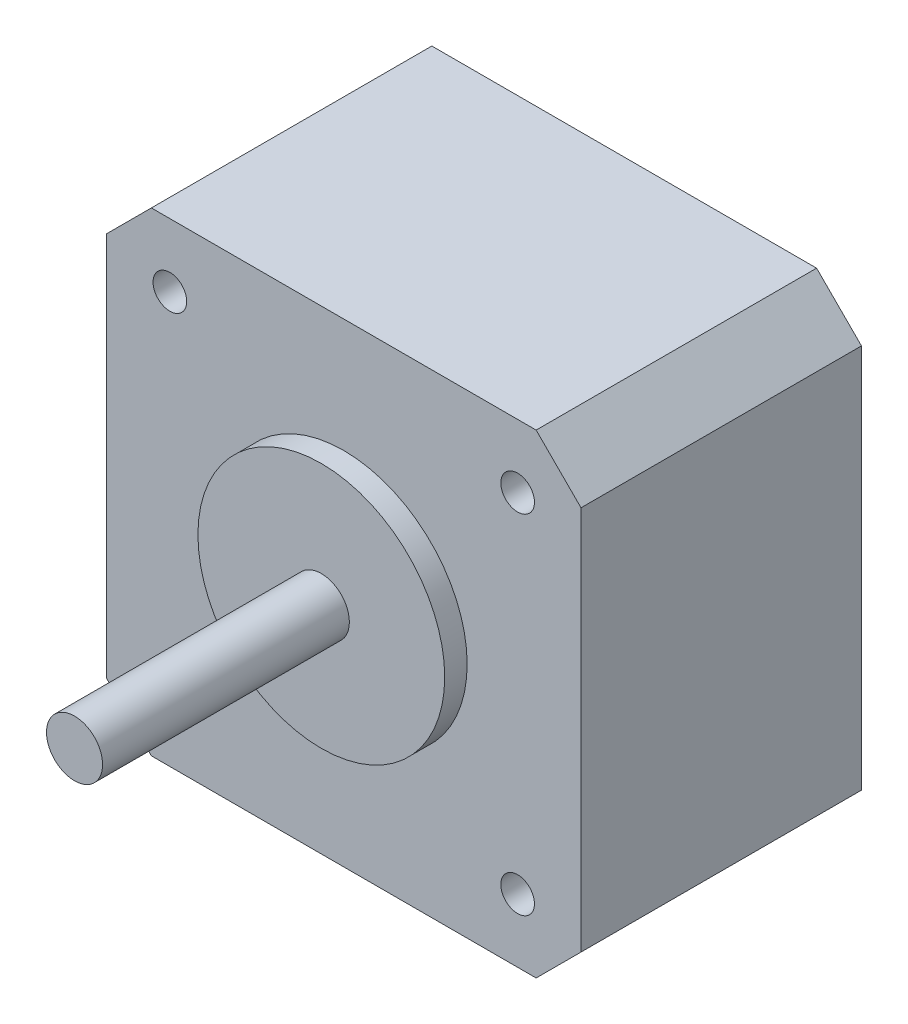
ISO-10303-21;
HEADER;
FILE_DESCRIPTION(('STEP AP214'),'2;1');
FILE_NAME('part.step','',(''),(''),'','','');
FILE_SCHEMA(('AUTOMOTIVE_DESIGN { 1 0 10303 214 1 1 1 1 }'));
ENDSEC;
DATA;
#1=APPLICATION_CONTEXT('core data for automotive mechanical design processes');
#2=APPLICATION_PROTOCOL_DEFINITION('international standard','automotive_design',2000,#1);
#3=PRODUCT_CONTEXT('',#1,'mechanical');
#4=PRODUCT('Part','Part','',(#3));
#5=PRODUCT_RELATED_PRODUCT_CATEGORY('part','',(#4));
#6=PRODUCT_DEFINITION_FORMATION('','',#4);
#7=PRODUCT_DEFINITION_CONTEXT('part definition',#1,'design');
#8=PRODUCT_DEFINITION('design','',#6,#7);
#9=PRODUCT_DEFINITION_SHAPE('','',#8);
#10=(LENGTH_UNIT() NAMED_UNIT(*) SI_UNIT(.MILLI.,.METRE.));
#11=(NAMED_UNIT(*) PLANE_ANGLE_UNIT() SI_UNIT($,.RADIAN.));
#12=(NAMED_UNIT(*) SI_UNIT($,.STERADIAN.) SOLID_ANGLE_UNIT());
#13=UNCERTAINTY_MEASURE_WITH_UNIT(LENGTH_MEASURE(1.E-05),#10,'distance_accuracy_value','');
#14=(GEOMETRIC_REPRESENTATION_CONTEXT(3) GLOBAL_UNCERTAINTY_ASSIGNED_CONTEXT((#13)) GLOBAL_UNIT_ASSIGNED_CONTEXT((#10,
#11,#12)) REPRESENTATION_CONTEXT('',''));
#15=CARTESIAN_POINT('',(0.,0.,0.));
#16=DIRECTION('',(0.,0.,1.));
#17=DIRECTION('',(1.,0.,0.));
#18=AXIS2_PLACEMENT_3D('',#15,#16,#17);
#19=CARTESIAN_POINT('',(21.15,21.15,-25.));
#20=DIRECTION('',(1.,0.,0.));
#21=DIRECTION('',(0.,0.,-1.));
#22=AXIS2_PLACEMENT_3D('',#19,#20,#21);
#23=PLANE('',#22);
#24=DIRECTION('',(0.,1.,0.));
#25=VECTOR('',#24,1.);
#26=CARTESIAN_POINT('',(21.15,21.15,0.));
#27=LINE('',#26,#25);
#28=CARTESIAN_POINT('',(21.15,-17.15,0.));
#29=VERTEX_POINT('',#28);
#30=CARTESIAN_POINT('',(21.15,17.15,0.));
#31=VERTEX_POINT('',#30);
#32=EDGE_CURVE('E158',#29,#31,#27,.T.);
#33=ORIENTED_EDGE('',*,*,#32,.F.);
#34=DIRECTION('',(0.,0.,-1.));
#35=VECTOR('',#34,1.);
#36=CARTESIAN_POINT('',(21.15,-17.15,-25.));
#37=LINE('',#36,#35);
#38=CARTESIAN_POINT('',(21.15,-17.15,-25.));
#39=VERTEX_POINT('',#38);
#40=EDGE_CURVE('E147',#29,#39,#37,.T.);
#41=ORIENTED_EDGE('',*,*,#40,.T.);
#42=DIRECTION('',(0.,1.,0.));
#43=VECTOR('',#42,1.);
#44=CARTESIAN_POINT('',(21.15,21.15,-25.));
#45=LINE('',#44,#43);
#46=CARTESIAN_POINT('',(21.15,17.15,-25.));
#47=VERTEX_POINT('',#46);
#48=EDGE_CURVE('E151',#39,#47,#45,.T.);
#49=ORIENTED_EDGE('',*,*,#48,.T.);
#50=DIRECTION('',(0.,0.,1.));
#51=VECTOR('',#50,1.);
#52=CARTESIAN_POINT('',(21.15,17.15,-25.));
#53=LINE('',#52,#51);
#54=EDGE_CURVE('E144',#47,#31,#53,.T.);
#55=ORIENTED_EDGE('',*,*,#54,.T.);
#56=EDGE_LOOP('',(#33,#41,#49,#55));
#57=FACE_BOUND('',#56,.T.);
#58=ADVANCED_FACE('F34',(#57),#23,.T.);
#59=CARTESIAN_POINT('',(-21.15,-21.15,-25.));
#60=DIRECTION('',(0.,-1.,0.));
#61=DIRECTION('',(0.,0.,-1.));
#62=AXIS2_PLACEMENT_3D('',#59,#60,#61);
#63=PLANE('',#62);
#64=DIRECTION('',(1.,0.,0.));
#65=VECTOR('',#64,1.);
#66=CARTESIAN_POINT('',(-21.15,-21.15,0.));
#67=LINE('',#66,#65);
#68=CARTESIAN_POINT('',(-17.15,-21.15,0.));
#69=VERTEX_POINT('',#68);
#70=CARTESIAN_POINT('',(17.15,-21.15,0.));
#71=VERTEX_POINT('',#70);
#72=EDGE_CURVE('E117',#69,#71,#67,.T.);
#73=ORIENTED_EDGE('',*,*,#72,.F.);
#74=DIRECTION('',(0.,0.,-1.));
#75=VECTOR('',#74,1.);
#76=CARTESIAN_POINT('',(-17.15,-21.15,-25.));
#77=LINE('',#76,#75);
#78=CARTESIAN_POINT('',(-17.15,-21.15,-25.));
#79=VERTEX_POINT('',#78);
#80=EDGE_CURVE('E135',#69,#79,#77,.T.);
#81=ORIENTED_EDGE('',*,*,#80,.T.);
#82=DIRECTION('',(1.,0.,0.));
#83=VECTOR('',#82,1.);
#84=CARTESIAN_POINT('',(-21.15,-21.15,-25.));
#85=LINE('',#84,#83);
#86=CARTESIAN_POINT('',(17.15,-21.15,-25.));
#87=VERTEX_POINT('',#86);
#88=EDGE_CURVE('E119',#79,#87,#85,.T.);
#89=ORIENTED_EDGE('',*,*,#88,.T.);
#90=DIRECTION('',(0.,0.,1.));
#91=VECTOR('',#90,1.);
#92=CARTESIAN_POINT('',(17.15,-21.15,-25.));
#93=LINE('',#92,#91);
#94=EDGE_CURVE('E132',#87,#71,#93,.T.);
#95=ORIENTED_EDGE('',*,*,#94,.T.);
#96=EDGE_LOOP('',(#73,#81,#89,#95));
#97=FACE_BOUND('',#96,.T.);
#98=ADVANCED_FACE('F241',(#97),#63,.T.);
#99=CARTESIAN_POINT('',(-21.15,21.15,-25.));
#100=DIRECTION('',(-1.,0.,0.));
#101=DIRECTION('',(0.,-1.,0.));
#102=AXIS2_PLACEMENT_3D('',#99,#100,#101);
#103=PLANE('',#102);
#104=DIRECTION('',(0.,-1.,0.));
#105=VECTOR('',#104,1.);
#106=CARTESIAN_POINT('',(-21.15,21.15,-25.));
#107=LINE('',#106,#105);
#108=CARTESIAN_POINT('',(-21.15,17.15,-25.));
#109=VERTEX_POINT('',#108);
#110=CARTESIAN_POINT('',(-21.15,-17.15,-25.));
#111=VERTEX_POINT('',#110);
#112=EDGE_CURVE('E123',#109,#111,#107,.T.);
#113=ORIENTED_EDGE('',*,*,#112,.T.);
#114=DIRECTION('',(0.,0.,1.));
#115=VECTOR('',#114,1.);
#116=CARTESIAN_POINT('',(-21.15,-17.15,-25.));
#117=LINE('',#116,#115);
#118=CARTESIAN_POINT('',(-21.15,-17.15,0.));
#119=VERTEX_POINT('',#118);
#120=EDGE_CURVE('E109',#111,#119,#117,.T.);
#121=ORIENTED_EDGE('',*,*,#120,.T.);
#122=DIRECTION('',(0.,-1.,0.));
#123=VECTOR('',#122,1.);
#124=CARTESIAN_POINT('',(-21.15,21.15,0.));
#125=LINE('',#124,#123);
#126=CARTESIAN_POINT('',(-21.15,17.15,0.));
#127=VERTEX_POINT('',#126);
#128=EDGE_CURVE('E102',#127,#119,#125,.T.);
#129=ORIENTED_EDGE('',*,*,#128,.F.);
#130=DIRECTION('',(0.,0.,-1.));
#131=VECTOR('',#130,1.);
#132=CARTESIAN_POINT('',(-21.15,17.15,-25.));
#133=LINE('',#132,#131);
#134=EDGE_CURVE('E115',#127,#109,#133,.T.);
#135=ORIENTED_EDGE('',*,*,#134,.T.);
#136=EDGE_LOOP('',(#113,#121,#129,#135));
#137=FACE_BOUND('',#136,.T.);
#138=ADVANCED_FACE('F114',(#137),#103,.T.);
#139=CARTESIAN_POINT('',(-21.15,21.15,-25.));
#140=DIRECTION('',(0.,1.,0.));
#141=DIRECTION('',(0.,0.,1.));
#142=AXIS2_PLACEMENT_3D('',#139,#140,#141);
#143=PLANE('',#142);
#144=DIRECTION('',(-1.,0.,0.));
#145=VECTOR('',#144,1.);
#146=CARTESIAN_POINT('',(-21.15,21.15,0.));
#147=LINE('',#146,#145);
#148=CARTESIAN_POINT('',(17.15,21.15,0.));
#149=VERTEX_POINT('',#148);
#150=CARTESIAN_POINT('',(-17.15,21.15,0.));
#151=VERTEX_POINT('',#150);
#152=EDGE_CURVE('E103',#149,#151,#147,.T.);
#153=ORIENTED_EDGE('',*,*,#152,.F.);
#154=DIRECTION('',(0.,0.,-1.));
#155=VECTOR('',#154,1.);
#156=CARTESIAN_POINT('',(17.15,21.15,-25.));
#157=LINE('',#156,#155);
#158=CARTESIAN_POINT('',(17.15,21.15,-25.));
#159=VERTEX_POINT('',#158);
#160=EDGE_CURVE('E12',#149,#159,#157,.T.);
#161=ORIENTED_EDGE('',*,*,#160,.T.);
#162=DIRECTION('',(-1.,0.,0.));
#163=VECTOR('',#162,1.);
#164=CARTESIAN_POINT('',(-21.15,21.15,-25.));
#165=LINE('',#164,#163);
#166=CARTESIAN_POINT('',(-17.15,21.15,-25.));
#167=VERTEX_POINT('',#166);
#168=EDGE_CURVE('E149',#159,#167,#165,.T.);
#169=ORIENTED_EDGE('',*,*,#168,.T.);
#170=DIRECTION('',(0.,0.,1.));
#171=VECTOR('',#170,1.);
#172=CARTESIAN_POINT('',(-17.15,21.15,-25.));
#173=LINE('',#172,#171);
#174=EDGE_CURVE('E42',#167,#151,#173,.T.);
#175=ORIENTED_EDGE('',*,*,#174,.T.);
#176=EDGE_LOOP('',(#153,#161,#169,#175));
#177=FACE_BOUND('',#176,.T.);
#178=ADVANCED_FACE('F148',(#177),#143,.T.);
#179=CARTESIAN_POINT('',(0.,0.,-25.));
#180=DIRECTION('',(0.,0.,1.));
#181=DIRECTION('',(1.,0.,0.));
#182=AXIS2_PLACEMENT_3D('',#179,#180,#181);
#183=PLANE('',#182);
#184=ORIENTED_EDGE('',*,*,#88,.F.);
#185=DIRECTION('',(0.707106781186549,-0.707106781186546,0.));
#186=VECTOR('',#185,1.);
#187=CARTESIAN_POINT('',(-21.15,-17.15,-25.));
#188=LINE('',#187,#186);
#189=EDGE_CURVE('E142',#79,#111,#188,.F.);
#190=ORIENTED_EDGE('',*,*,#189,.T.);
#191=ORIENTED_EDGE('',*,*,#112,.F.);
#192=DIRECTION('',(-0.707106781186546,-0.707106781186549,0.));
#193=VECTOR('',#192,1.);
#194=CARTESIAN_POINT('',(-17.15,21.15,-25.));
#195=LINE('',#194,#193);
#196=EDGE_CURVE('E49',#109,#167,#195,.F.);
#197=ORIENTED_EDGE('',*,*,#196,.T.);
#198=ORIENTED_EDGE('',*,*,#168,.F.);
#199=DIRECTION('',(-0.707106781186549,0.707106781186546,0.));
#200=VECTOR('',#199,1.);
#201=CARTESIAN_POINT('',(21.15,17.15,-25.));
#202=LINE('',#201,#200);
#203=EDGE_CURVE('E138',#159,#47,#202,.F.);
#204=ORIENTED_EDGE('',*,*,#203,.T.);
#205=ORIENTED_EDGE('',*,*,#48,.F.);
#206=DIRECTION('',(0.707106781186545,0.70710678118655,0.));
#207=VECTOR('',#206,1.);
#208=CARTESIAN_POINT('',(17.15,-21.15,-25.));
#209=LINE('',#208,#207);
#210=EDGE_CURVE('E140',#39,#87,#209,.F.);
#211=ORIENTED_EDGE('',*,*,#210,.T.);
#212=EDGE_LOOP('',(#184,#190,#191,#197,#198,#204,#205,#211));
#213=FACE_BOUND('',#212,.T.);
#214=ADVANCED_FACE('F220',(#213),#183,.F.);
#215=CARTESIAN_POINT('',(0.,0.,0.));
#216=DIRECTION('',(0.,0.,1.));
#217=DIRECTION('',(1.,0.,0.));
#218=AXIS2_PLACEMENT_3D('',#215,#216,#217);
#219=PLANE('',#218);
#220=CARTESIAN_POINT('',(0.,0.,0.));
#221=DIRECTION('',(0.,0.,1.));
#222=DIRECTION('',(1.,0.,0.));
#223=AXIS2_PLACEMENT_3D('',#220,#221,#222);
#224=CIRCLE('',#223,11.);
#225=CARTESIAN_POINT('',(11.,0.,0.));
#226=VERTEX_POINT('',#225);
#227=EDGE_CURVE('E189',#226,#226,#224,.T.);
#228=ORIENTED_EDGE('',*,*,#227,.F.);
#229=EDGE_LOOP('',(#228));
#230=FACE_BOUND('',#229,.T.);
#231=CARTESIAN_POINT('',(15.5,15.5,0.));
#232=DIRECTION('',(0.,0.,1.));
#233=DIRECTION('',(1.,0.,0.));
#234=AXIS2_PLACEMENT_3D('',#231,#232,#233);
#235=CIRCLE('',#234,1.5);
#236=CARTESIAN_POINT('',(17.,15.5,0.));
#237=VERTEX_POINT('',#236);
#238=EDGE_CURVE('E184',#237,#237,#235,.T.);
#239=ORIENTED_EDGE('',*,*,#238,.F.);
#240=EDGE_LOOP('',(#239));
#241=FACE_BOUND('',#240,.T.);
#242=CARTESIAN_POINT('',(15.5,-15.5,0.));
#243=DIRECTION('',(0.,0.,1.));
#244=DIRECTION('',(1.,0.,0.));
#245=AXIS2_PLACEMENT_3D('',#242,#243,#244);
#246=CIRCLE('',#245,1.5);
#247=CARTESIAN_POINT('',(17.,-15.5,0.));
#248=VERTEX_POINT('',#247);
#249=EDGE_CURVE('E178',#248,#248,#246,.T.);
#250=ORIENTED_EDGE('',*,*,#249,.F.);
#251=EDGE_LOOP('',(#250));
#252=FACE_BOUND('',#251,.T.);
#253=CARTESIAN_POINT('',(-15.5,-15.5,0.));
#254=DIRECTION('',(0.,0.,1.));
#255=DIRECTION('',(1.,0.,0.));
#256=AXIS2_PLACEMENT_3D('',#253,#254,#255);
#257=CIRCLE('',#256,1.5);
#258=CARTESIAN_POINT('',(-14.,-15.5,0.));
#259=VERTEX_POINT('',#258);
#260=EDGE_CURVE('E171',#259,#259,#257,.T.);
#261=ORIENTED_EDGE('',*,*,#260,.F.);
#262=EDGE_LOOP('',(#261));
#263=FACE_BOUND('',#262,.T.);
#264=CARTESIAN_POINT('',(-15.5,15.5,0.));
#265=DIRECTION('',(0.,0.,1.));
#266=DIRECTION('',(1.,0.,0.));
#267=AXIS2_PLACEMENT_3D('',#264,#265,#266);
#268=CIRCLE('',#267,1.5);
#269=CARTESIAN_POINT('',(-14.,15.5,0.));
#270=VERTEX_POINT('',#269);
#271=EDGE_CURVE('E164',#270,#270,#268,.T.);
#272=ORIENTED_EDGE('',*,*,#271,.F.);
#273=EDGE_LOOP('',(#272));
#274=FACE_BOUND('',#273,.T.);
#275=ORIENTED_EDGE('',*,*,#128,.T.);
#276=DIRECTION('',(-0.707106781186549,0.707106781186546,0.));
#277=VECTOR('',#276,1.);
#278=CARTESIAN_POINT('',(-19.15,-19.15,0.));
#279=LINE('',#278,#277);
#280=EDGE_CURVE('E130',#119,#69,#279,.F.);
#281=ORIENTED_EDGE('',*,*,#280,.T.);
#282=ORIENTED_EDGE('',*,*,#72,.T.);
#283=DIRECTION('',(-0.707106781186545,-0.70710678118655,0.));
#284=VECTOR('',#283,1.);
#285=CARTESIAN_POINT('',(19.15,-19.1499999999999,0.));
#286=LINE('',#285,#284);
#287=EDGE_CURVE('E128',#71,#29,#286,.F.);
#288=ORIENTED_EDGE('',*,*,#287,.T.);
#289=ORIENTED_EDGE('',*,*,#32,.T.);
#290=DIRECTION('',(0.707106781186549,-0.707106781186546,0.));
#291=VECTOR('',#290,1.);
#292=CARTESIAN_POINT('',(19.1499999999999,19.15,0.));
#293=LINE('',#292,#291);
#294=EDGE_CURVE('E108',#31,#149,#293,.F.);
#295=ORIENTED_EDGE('',*,*,#294,.T.);
#296=ORIENTED_EDGE('',*,*,#152,.T.);
#297=DIRECTION('',(0.707106781186546,0.707106781186549,0.));
#298=VECTOR('',#297,1.);
#299=CARTESIAN_POINT('',(-19.15,19.1499999999999,0.));
#300=LINE('',#299,#298);
#301=EDGE_CURVE('E99',#151,#127,#300,.F.);
#302=ORIENTED_EDGE('',*,*,#301,.T.);
#303=EDGE_LOOP('',(#275,#281,#282,#288,#289,#295,#296,#302));
#304=FACE_BOUND('',#303,.T.);
#305=ADVANCED_FACE('F101',(#230,#241,#252,#263,#274,#304),#219,.T.);
#306=CARTESIAN_POINT('',(-15.5,15.5,-6.));
#307=DIRECTION('',(0.,0.,1.));
#308=DIRECTION('',(1.,0.,0.));
#309=AXIS2_PLACEMENT_3D('',#306,#307,#308);
#310=CYLINDRICAL_SURFACE('',#309,1.5);
#311=CARTESIAN_POINT('',(-15.5,15.5,-6.));
#312=DIRECTION('',(0.,0.,1.));
#313=DIRECTION('',(1.,0.,0.));
#314=AXIS2_PLACEMENT_3D('',#311,#312,#313);
#315=CIRCLE('',#314,1.5);
#316=CARTESIAN_POINT('',(-14.,15.5,-6.));
#317=VERTEX_POINT('',#316);
#318=EDGE_CURVE('E161',#317,#317,#315,.T.);
#319=ORIENTED_EDGE('',*,*,#318,.F.);
#320=EDGE_LOOP('',(#319));
#321=FACE_BOUND('',#320,.T.);
#322=ORIENTED_EDGE('',*,*,#271,.T.);
#323=EDGE_LOOP('',(#322));
#324=FACE_BOUND('',#323,.T.);
#325=ADVANCED_FACE('F219',(#321,#324),#310,.F.);
#326=CARTESIAN_POINT('',(-15.5,15.5,-6.));
#327=DIRECTION('',(0.,0.,1.));
#328=DIRECTION('',(1.,0.,0.));
#329=AXIS2_PLACEMENT_3D('',#326,#327,#328);
#330=PLANE('',#329);
#331=ORIENTED_EDGE('',*,*,#318,.T.);
#332=EDGE_LOOP('',(#331));
#333=FACE_BOUND('',#332,.T.);
#334=ADVANCED_FACE('F231',(#333),#330,.T.);
#335=CARTESIAN_POINT('',(-15.5,-15.5,-6.));
#336=DIRECTION('',(0.,0.,1.));
#337=DIRECTION('',(1.,0.,0.));
#338=AXIS2_PLACEMENT_3D('',#335,#336,#337);
#339=CYLINDRICAL_SURFACE('',#338,1.5);
#340=CARTESIAN_POINT('',(-15.5,-15.5,-6.));
#341=DIRECTION('',(0.,0.,1.));
#342=DIRECTION('',(1.,0.,0.));
#343=AXIS2_PLACEMENT_3D('',#340,#341,#342);
#344=CIRCLE('',#343,1.5);
#345=CARTESIAN_POINT('',(-14.,-15.5,-6.));
#346=VERTEX_POINT('',#345);
#347=EDGE_CURVE('E174',#346,#346,#344,.T.);
#348=ORIENTED_EDGE('',*,*,#347,.F.);
#349=EDGE_LOOP('',(#348));
#350=FACE_BOUND('',#349,.T.);
#351=ORIENTED_EDGE('',*,*,#260,.T.);
#352=EDGE_LOOP('',(#351));
#353=FACE_BOUND('',#352,.T.);
#354=ADVANCED_FACE('F237',(#350,#353),#339,.F.);
#355=CARTESIAN_POINT('',(-15.5,-15.5,-6.));
#356=DIRECTION('',(0.,0.,1.));
#357=DIRECTION('',(1.,0.,0.));
#358=AXIS2_PLACEMENT_3D('',#355,#356,#357);
#359=PLANE('',#358);
#360=ORIENTED_EDGE('',*,*,#347,.T.);
#361=EDGE_LOOP('',(#360));
#362=FACE_BOUND('',#361,.T.);
#363=ADVANCED_FACE('F375',(#362),#359,.T.);
#364=CARTESIAN_POINT('',(15.5,-15.5,-6.));
#365=DIRECTION('',(0.,0.,1.));
#366=DIRECTION('',(1.,0.,0.));
#367=AXIS2_PLACEMENT_3D('',#364,#365,#366);
#368=CYLINDRICAL_SURFACE('',#367,1.5);
#369=CARTESIAN_POINT('',(15.5,-15.5,-6.));
#370=DIRECTION('',(0.,0.,1.));
#371=DIRECTION('',(1.,0.,0.));
#372=AXIS2_PLACEMENT_3D('',#369,#370,#371);
#373=CIRCLE('',#372,1.5);
#374=CARTESIAN_POINT('',(17.,-15.5,-6.));
#375=VERTEX_POINT('',#374);
#376=EDGE_CURVE('E181',#375,#375,#373,.T.);
#377=ORIENTED_EDGE('',*,*,#376,.F.);
#378=EDGE_LOOP('',(#377));
#379=FACE_BOUND('',#378,.T.);
#380=ORIENTED_EDGE('',*,*,#249,.T.);
#381=EDGE_LOOP('',(#380));
#382=FACE_BOUND('',#381,.T.);
#383=ADVANCED_FACE('F367',(#379,#382),#368,.F.);
#384=CARTESIAN_POINT('',(15.5,-15.5,-6.));
#385=DIRECTION('',(0.,0.,1.));
#386=DIRECTION('',(1.,0.,0.));
#387=AXIS2_PLACEMENT_3D('',#384,#385,#386);
#388=PLANE('',#387);
#389=ORIENTED_EDGE('',*,*,#376,.T.);
#390=EDGE_LOOP('',(#389));
#391=FACE_BOUND('',#390,.T.);
#392=ADVANCED_FACE('F359',(#391),#388,.T.);
#393=CARTESIAN_POINT('',(15.5,15.5,-6.));
#394=DIRECTION('',(0.,0.,1.));
#395=DIRECTION('',(1.,0.,0.));
#396=AXIS2_PLACEMENT_3D('',#393,#394,#395);
#397=CYLINDRICAL_SURFACE('',#396,1.5);
#398=CARTESIAN_POINT('',(15.5,15.5,-6.));
#399=DIRECTION('',(0.,0.,1.));
#400=DIRECTION('',(1.,0.,0.));
#401=AXIS2_PLACEMENT_3D('',#398,#399,#400);
#402=CIRCLE('',#401,1.5);
#403=CARTESIAN_POINT('',(17.,15.5,-6.));
#404=VERTEX_POINT('',#403);
#405=EDGE_CURVE('E169',#404,#404,#402,.T.);
#406=ORIENTED_EDGE('',*,*,#405,.F.);
#407=EDGE_LOOP('',(#406));
#408=FACE_BOUND('',#407,.T.);
#409=ORIENTED_EDGE('',*,*,#238,.T.);
#410=EDGE_LOOP('',(#409));
#411=FACE_BOUND('',#410,.T.);
#412=ADVANCED_FACE('F351',(#408,#411),#397,.F.);
#413=CARTESIAN_POINT('',(15.5,15.5,-6.));
#414=DIRECTION('',(0.,0.,1.));
#415=DIRECTION('',(1.,0.,0.));
#416=AXIS2_PLACEMENT_3D('',#413,#414,#415);
#417=PLANE('',#416);
#418=ORIENTED_EDGE('',*,*,#405,.T.);
#419=EDGE_LOOP('',(#418));
#420=FACE_BOUND('',#419,.T.);
#421=ADVANCED_FACE('F213',(#420),#417,.T.);
#422=CARTESIAN_POINT('',(0.,0.,2.));
#423=DIRECTION('',(0.,0.,-1.));
#424=DIRECTION('',(-1.,0.,0.));
#425=AXIS2_PLACEMENT_3D('',#422,#423,#424);
#426=CYLINDRICAL_SURFACE('',#425,11.);
#427=CARTESIAN_POINT('',(0.,0.,2.));
#428=DIRECTION('',(0.,0.,1.));
#429=DIRECTION('',(1.,0.,0.));
#430=AXIS2_PLACEMENT_3D('',#427,#428,#429);
#431=CIRCLE('',#430,11.);
#432=CARTESIAN_POINT('',(11.,0.,2.));
#433=VERTEX_POINT('',#432);
#434=EDGE_CURVE('E175',#433,#433,#431,.T.);
#435=ORIENTED_EDGE('',*,*,#434,.F.);
#436=EDGE_LOOP('',(#435));
#437=FACE_BOUND('',#436,.T.);
#438=ORIENTED_EDGE('',*,*,#227,.T.);
#439=EDGE_LOOP('',(#438));
#440=FACE_BOUND('',#439,.T.);
#441=ADVANCED_FACE('F207',(#437,#440),#426,.T.);
#442=CARTESIAN_POINT('',(0.,0.,2.));
#443=DIRECTION('',(0.,0.,1.));
#444=DIRECTION('',(1.,0.,0.));
#445=AXIS2_PLACEMENT_3D('',#442,#443,#444);
#446=PLANE('',#445);
#447=CARTESIAN_POINT('',(0.,0.,2.));
#448=DIRECTION('',(0.,0.,1.));
#449=DIRECTION('',(1.,0.,0.));
#450=AXIS2_PLACEMENT_3D('',#447,#448,#449);
#451=CIRCLE('',#450,2.5);
#452=CARTESIAN_POINT('',(2.5,0.,2.));
#453=VERTEX_POINT('',#452);
#454=EDGE_CURVE('E197',#453,#453,#451,.T.);
#455=ORIENTED_EDGE('',*,*,#454,.F.);
#456=EDGE_LOOP('',(#455));
#457=FACE_BOUND('',#456,.T.);
#458=ORIENTED_EDGE('',*,*,#434,.T.);
#459=EDGE_LOOP('',(#458));
#460=FACE_BOUND('',#459,.T.);
#461=ADVANCED_FACE('F204',(#457,#460),#446,.T.);
#462=CARTESIAN_POINT('',(0.,0.,55.0710678118655));
#463=DIRECTION('',(0.,0.,-1.));
#464=DIRECTION('',(-1.,0.,0.));
#465=AXIS2_PLACEMENT_3D('',#462,#463,#464);
#466=CYLINDRICAL_SURFACE('',#465,2.5);
#467=ORIENTED_EDGE('',*,*,#454,.T.);
#468=EDGE_LOOP('',(#467));
#469=FACE_BOUND('',#468,.T.);
#470=CARTESIAN_POINT('',(0.,0.,24.));
#471=DIRECTION('',(0.,0.,1.));
#472=DIRECTION('',(1.,0.,0.));
#473=AXIS2_PLACEMENT_3D('',#470,#471,#472);
#474=CIRCLE('',#473,2.5);
#475=CARTESIAN_POINT('',(2.5,0.,24.));
#476=VERTEX_POINT('',#475);
#477=EDGE_CURVE('E192',#476,#476,#474,.T.);
#478=ORIENTED_EDGE('',*,*,#477,.F.);
#479=EDGE_LOOP('',(#478));
#480=FACE_BOUND('',#479,.T.);
#481=ADVANCED_FACE('F201',(#469,#480),#466,.T.);
#482=CARTESIAN_POINT('',(0.,0.,24.));
#483=DIRECTION('',(0.,0.,1.));
#484=DIRECTION('',(1.,0.,0.));
#485=AXIS2_PLACEMENT_3D('',#482,#483,#484);
#486=PLANE('',#485);
#487=ORIENTED_EDGE('',*,*,#477,.T.);
#488=EDGE_LOOP('',(#487));
#489=FACE_BOUND('',#488,.T.);
#490=ADVANCED_FACE('F256',(#489),#486,.T.);
#491=CARTESIAN_POINT('',(-21.15,-17.15,-25.));
#492=DIRECTION('',(0.707106781186546,0.707106781186549,0.));
#493=DIRECTION('',(0.,0.,1.));
#494=AXIS2_PLACEMENT_3D('',#491,#492,#493);
#495=PLANE('',#494);
#496=ORIENTED_EDGE('',*,*,#189,.F.);
#497=ORIENTED_EDGE('',*,*,#80,.F.);
#498=ORIENTED_EDGE('',*,*,#280,.F.);
#499=ORIENTED_EDGE('',*,*,#120,.F.);
#500=EDGE_LOOP('',(#496,#497,#498,#499));
#501=FACE_BOUND('',#500,.T.);
#502=ADVANCED_FACE('F252',(#501),#495,.F.);
#503=CARTESIAN_POINT('',(17.15,-21.15,-25.));
#504=DIRECTION('',(-0.70710678118655,0.707106781186545,0.));
#505=DIRECTION('',(0.,0.,1.));
#506=AXIS2_PLACEMENT_3D('',#503,#504,#505);
#507=PLANE('',#506);
#508=ORIENTED_EDGE('',*,*,#210,.F.);
#509=ORIENTED_EDGE('',*,*,#40,.F.);
#510=ORIENTED_EDGE('',*,*,#287,.F.);
#511=ORIENTED_EDGE('',*,*,#94,.F.);
#512=EDGE_LOOP('',(#508,#509,#510,#511));
#513=FACE_BOUND('',#512,.T.);
#514=ADVANCED_FACE('F255',(#513),#507,.F.);
#515=CARTESIAN_POINT('',(21.15,17.15,-25.));
#516=DIRECTION('',(-0.707106781186546,-0.707106781186549,0.));
#517=DIRECTION('',(0.,0.,1.));
#518=AXIS2_PLACEMENT_3D('',#515,#516,#517);
#519=PLANE('',#518);
#520=ORIENTED_EDGE('',*,*,#203,.F.);
#521=ORIENTED_EDGE('',*,*,#160,.F.);
#522=ORIENTED_EDGE('',*,*,#294,.F.);
#523=ORIENTED_EDGE('',*,*,#54,.F.);
#524=EDGE_LOOP('',(#520,#521,#522,#523));
#525=FACE_BOUND('',#524,.T.);
#526=ADVANCED_FACE('F259',(#525),#519,.F.);
#527=CARTESIAN_POINT('',(-17.15,21.15,-25.));
#528=DIRECTION('',(0.707106781186549,-0.707106781186546,0.));
#529=DIRECTION('',(0.,0.,1.));
#530=AXIS2_PLACEMENT_3D('',#527,#528,#529);
#531=PLANE('',#530);
#532=ORIENTED_EDGE('',*,*,#196,.F.);
#533=ORIENTED_EDGE('',*,*,#134,.F.);
#534=ORIENTED_EDGE('',*,*,#301,.F.);
#535=ORIENTED_EDGE('',*,*,#174,.F.);
#536=EDGE_LOOP('',(#532,#533,#534,#535));
#537=FACE_BOUND('',#536,.T.);
#538=ADVANCED_FACE('F36',(#537),#531,.F.);
#539=CLOSED_SHELL('',(#58,#98,#138,#178,#214,#305,#325,#334,#354,#363,#383,#392,#412,#421,#441,
#461,#481,#490,#502,#514,#526,#538));
#540=MANIFOLD_SOLID_BREP('B2',#539);
#541=ADVANCED_BREP_SHAPE_REPRESENTATION('',(#18,#540),#14);
#542=SHAPE_DEFINITION_REPRESENTATION(#9,#541);
ENDSEC;
END-ISO-10303-21;
